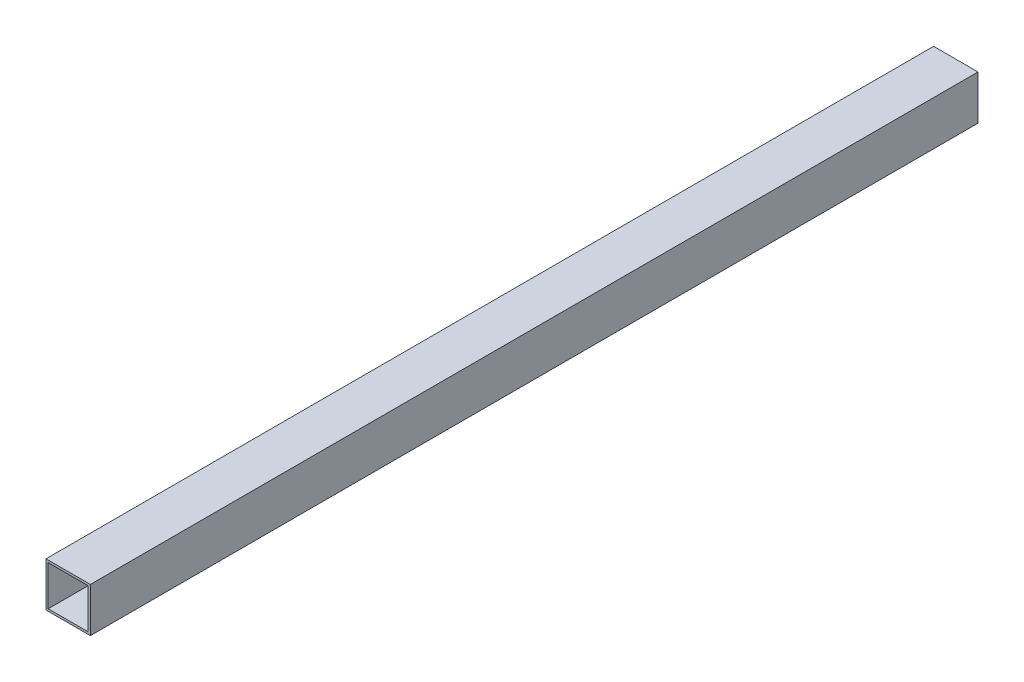
ISO-10303-21;
HEADER;
FILE_DESCRIPTION(('STEP AP214'),'2;1');
FILE_NAME('part.step','',(''),(''),'','','');
FILE_SCHEMA(('AUTOMOTIVE_DESIGN { 1 0 10303 214 1 1 1 1 }'));
ENDSEC;
DATA;
#1=APPLICATION_CONTEXT('core data for automotive mechanical design processes');
#2=APPLICATION_PROTOCOL_DEFINITION('international standard','automotive_design',2000,#1);
#3=PRODUCT_CONTEXT('',#1,'mechanical');
#4=PRODUCT('Part','Part','',(#3));
#5=PRODUCT_RELATED_PRODUCT_CATEGORY('part','',(#4));
#6=PRODUCT_DEFINITION_FORMATION('','',#4);
#7=PRODUCT_DEFINITION_CONTEXT('part definition',#1,'design');
#8=PRODUCT_DEFINITION('design','',#6,#7);
#9=PRODUCT_DEFINITION_SHAPE('','',#8);
#10=(LENGTH_UNIT() NAMED_UNIT(*) SI_UNIT(.MILLI.,.METRE.));
#11=(NAMED_UNIT(*) PLANE_ANGLE_UNIT() SI_UNIT($,.RADIAN.));
#12=(NAMED_UNIT(*) SI_UNIT($,.STERADIAN.) SOLID_ANGLE_UNIT());
#13=UNCERTAINTY_MEASURE_WITH_UNIT(LENGTH_MEASURE(1.E-05),#10,'distance_accuracy_value','');
#14=(GEOMETRIC_REPRESENTATION_CONTEXT(3) GLOBAL_UNCERTAINTY_ASSIGNED_CONTEXT((#13)) GLOBAL_UNIT_ASSIGNED_CONTEXT((#10,
#11,#12)) REPRESENTATION_CONTEXT('',''));
#15=CARTESIAN_POINT('',(0.,0.,0.));
#16=DIRECTION('',(0.,0.,1.));
#17=DIRECTION('',(1.,0.,0.));
#18=AXIS2_PLACEMENT_3D('',#15,#16,#17);
#19=CARTESIAN_POINT('',(0.,0.,400.));
#20=DIRECTION('',(0.,0.,-1.));
#21=DIRECTION('',(-1.,0.,0.));
#22=AXIS2_PLACEMENT_3D('',#19,#20,#21);
#23=PLANE('',#22);
#24=DIRECTION('',(0.,1.,0.));
#25=VECTOR('',#24,1.);
#26=CARTESIAN_POINT('',(10.,-10.,400.));
#27=LINE('',#26,#25);
#28=CARTESIAN_POINT('',(10.,-10.,400.));
#29=VERTEX_POINT('',#28);
#30=CARTESIAN_POINT('',(10.,10.,400.));
#31=VERTEX_POINT('',#30);
#32=EDGE_CURVE('E153',#29,#31,#27,.T.);
#33=ORIENTED_EDGE('',*,*,#32,.T.);
#34=DIRECTION('',(-1.,0.,0.));
#35=VECTOR('',#34,1.);
#36=CARTESIAN_POINT('',(-10.,10.,400.));
#37=LINE('',#36,#35);
#38=CARTESIAN_POINT('',(-10.,10.,400.));
#39=VERTEX_POINT('',#38);
#40=EDGE_CURVE('E157',#31,#39,#37,.T.);
#41=ORIENTED_EDGE('',*,*,#40,.T.);
#42=DIRECTION('',(0.,-1.,0.));
#43=VECTOR('',#42,1.);
#44=CARTESIAN_POINT('',(-10.,-10.,400.));
#45=LINE('',#44,#43);
#46=CARTESIAN_POINT('',(-10.,-10.,400.));
#47=VERTEX_POINT('',#46);
#48=EDGE_CURVE('E161',#39,#47,#45,.T.);
#49=ORIENTED_EDGE('',*,*,#48,.T.);
#50=DIRECTION('',(1.,0.,0.));
#51=VECTOR('',#50,1.);
#52=CARTESIAN_POINT('',(-10.,-10.,400.));
#53=LINE('',#52,#51);
#54=EDGE_CURVE('E164',#47,#29,#53,.T.);
#55=ORIENTED_EDGE('',*,*,#54,.T.);
#56=EDGE_LOOP('',(#33,#41,#49,#55));
#57=FACE_BOUND('',#56,.T.);
#58=DIRECTION('',(0.,-1.,0.));
#59=VECTOR('',#58,1.);
#60=CARTESIAN_POINT('',(-9.,-9.,400.));
#61=LINE('',#60,#59);
#62=CARTESIAN_POINT('',(-9.,9.,400.));
#63=VERTEX_POINT('',#62);
#64=CARTESIAN_POINT('',(-9.,-9.,400.));
#65=VERTEX_POINT('',#64);
#66=EDGE_CURVE('E105',#63,#65,#61,.T.);
#67=ORIENTED_EDGE('',*,*,#66,.F.);
#68=DIRECTION('',(-1.,0.,0.));
#69=VECTOR('',#68,1.);
#70=CARTESIAN_POINT('',(-9.,9.,400.));
#71=LINE('',#70,#69);
#72=CARTESIAN_POINT('',(9.,9.,400.));
#73=VERTEX_POINT('',#72);
#74=EDGE_CURVE('E131',#73,#63,#71,.T.);
#75=ORIENTED_EDGE('',*,*,#74,.F.);
#76=DIRECTION('',(0.,1.,0.));
#77=VECTOR('',#76,1.);
#78=CARTESIAN_POINT('',(9.,-9.,400.));
#79=LINE('',#78,#77);
#80=CARTESIAN_POINT('',(9.,-9.,400.));
#81=VERTEX_POINT('',#80);
#82=EDGE_CURVE('E127',#81,#73,#79,.T.);
#83=ORIENTED_EDGE('',*,*,#82,.F.);
#84=DIRECTION('',(1.,0.,0.));
#85=VECTOR('',#84,1.);
#86=CARTESIAN_POINT('',(-9.,-9.,400.));
#87=LINE('',#86,#85);
#88=EDGE_CURVE('E114',#65,#81,#87,.T.);
#89=ORIENTED_EDGE('',*,*,#88,.F.);
#90=EDGE_LOOP('',(#67,#75,#83,#89));
#91=FACE_BOUND('',#90,.T.);
#92=ADVANCED_FACE('F39',(#57,#91),#23,.F.);
#93=CARTESIAN_POINT('',(0.,0.,0.));
#94=DIRECTION('',(0.,0.,-1.));
#95=DIRECTION('',(-1.,0.,0.));
#96=AXIS2_PLACEMENT_3D('',#93,#94,#95);
#97=PLANE('',#96);
#98=DIRECTION('',(0.,1.,0.));
#99=VECTOR('',#98,1.);
#100=CARTESIAN_POINT('',(10.,-10.,0.));
#101=LINE('',#100,#99);
#102=CARTESIAN_POINT('',(10.,-10.,0.));
#103=VERTEX_POINT('',#102);
#104=CARTESIAN_POINT('',(10.,10.,0.));
#105=VERTEX_POINT('',#104);
#106=EDGE_CURVE('E123',#103,#105,#101,.T.);
#107=ORIENTED_EDGE('',*,*,#106,.F.);
#108=DIRECTION('',(1.,0.,0.));
#109=VECTOR('',#108,1.);
#110=CARTESIAN_POINT('',(-10.,-10.,0.));
#111=LINE('',#110,#109);
#112=CARTESIAN_POINT('',(-10.,-10.,0.));
#113=VERTEX_POINT('',#112);
#114=EDGE_CURVE('E158',#113,#103,#111,.T.);
#115=ORIENTED_EDGE('',*,*,#114,.F.);
#116=DIRECTION('',(0.,-1.,0.));
#117=VECTOR('',#116,1.);
#118=CARTESIAN_POINT('',(-10.,-10.,0.));
#119=LINE('',#118,#117);
#120=CARTESIAN_POINT('',(-10.,10.,0.));
#121=VERTEX_POINT('',#120);
#122=EDGE_CURVE('E174',#121,#113,#119,.T.);
#123=ORIENTED_EDGE('',*,*,#122,.F.);
#124=DIRECTION('',(-1.,0.,0.));
#125=VECTOR('',#124,1.);
#126=CARTESIAN_POINT('',(-10.,10.,0.));
#127=LINE('',#126,#125);
#128=EDGE_CURVE('E171',#105,#121,#127,.T.);
#129=ORIENTED_EDGE('',*,*,#128,.F.);
#130=EDGE_LOOP('',(#107,#115,#123,#129));
#131=FACE_BOUND('',#130,.T.);
#132=DIRECTION('',(-1.,0.,0.));
#133=VECTOR('',#132,1.);
#134=CARTESIAN_POINT('',(-9.,9.,0.));
#135=LINE('',#134,#133);
#136=CARTESIAN_POINT('',(9.,9.,0.));
#137=VERTEX_POINT('',#136);
#138=CARTESIAN_POINT('',(-9.,9.,0.));
#139=VERTEX_POINT('',#138);
#140=EDGE_CURVE('E115',#137,#139,#135,.T.);
#141=ORIENTED_EDGE('',*,*,#140,.T.);
#142=DIRECTION('',(0.,-1.,0.));
#143=VECTOR('',#142,1.);
#144=CARTESIAN_POINT('',(-9.,-9.,0.));
#145=LINE('',#144,#143);
#146=CARTESIAN_POINT('',(-9.,-9.,0.));
#147=VERTEX_POINT('',#146);
#148=EDGE_CURVE('E63',#139,#147,#145,.T.);
#149=ORIENTED_EDGE('',*,*,#148,.T.);
#150=DIRECTION('',(1.,0.,0.));
#151=VECTOR('',#150,1.);
#152=CARTESIAN_POINT('',(-9.,-9.,0.));
#153=LINE('',#152,#151);
#154=CARTESIAN_POINT('',(9.,-9.,0.));
#155=VERTEX_POINT('',#154);
#156=EDGE_CURVE('E121',#147,#155,#153,.T.);
#157=ORIENTED_EDGE('',*,*,#156,.T.);
#158=DIRECTION('',(0.,1.,0.));
#159=VECTOR('',#158,1.);
#160=CARTESIAN_POINT('',(9.,-9.,0.));
#161=LINE('',#160,#159);
#162=EDGE_CURVE('E140',#155,#137,#161,.T.);
#163=ORIENTED_EDGE('',*,*,#162,.T.);
#164=EDGE_LOOP('',(#141,#149,#157,#163));
#165=FACE_BOUND('',#164,.T.);
#166=ADVANCED_FACE('F197',(#131,#165),#97,.T.);
#167=CARTESIAN_POINT('',(10.,-10.,400.));
#168=DIRECTION('',(-1.,0.,0.));
#169=DIRECTION('',(0.,0.,1.));
#170=AXIS2_PLACEMENT_3D('',#167,#168,#169);
#171=PLANE('',#170);
#172=ORIENTED_EDGE('',*,*,#106,.T.);
#173=DIRECTION('',(0.,0.,-1.));
#174=VECTOR('',#173,1.);
#175=CARTESIAN_POINT('',(10.,10.,400.));
#176=LINE('',#175,#174);
#177=EDGE_CURVE('E11',#31,#105,#176,.T.);
#178=ORIENTED_EDGE('',*,*,#177,.F.);
#179=ORIENTED_EDGE('',*,*,#32,.F.);
#180=DIRECTION('',(0.,0.,-1.));
#181=VECTOR('',#180,1.);
#182=CARTESIAN_POINT('',(10.,-10.,400.));
#183=LINE('',#182,#181);
#184=EDGE_CURVE('E167',#29,#103,#183,.T.);
#185=ORIENTED_EDGE('',*,*,#184,.T.);
#186=EDGE_LOOP('',(#172,#178,#179,#185));
#187=FACE_BOUND('',#186,.T.);
#188=ADVANCED_FACE('F41',(#187),#171,.F.);
#189=CARTESIAN_POINT('',(-10.,10.,400.));
#190=DIRECTION('',(0.,-1.,0.));
#191=DIRECTION('',(0.,0.,-1.));
#192=AXIS2_PLACEMENT_3D('',#189,#190,#191);
#193=PLANE('',#192);
#194=ORIENTED_EDGE('',*,*,#128,.T.);
#195=DIRECTION('',(0.,0.,-1.));
#196=VECTOR('',#195,1.);
#197=CARTESIAN_POINT('',(-10.,10.,400.));
#198=LINE('',#197,#196);
#199=EDGE_CURVE('E48',#39,#121,#198,.T.);
#200=ORIENTED_EDGE('',*,*,#199,.F.);
#201=ORIENTED_EDGE('',*,*,#40,.F.);
#202=ORIENTED_EDGE('',*,*,#177,.T.);
#203=EDGE_LOOP('',(#194,#200,#201,#202));
#204=FACE_BOUND('',#203,.T.);
#205=ADVANCED_FACE('F207',(#204),#193,.F.);
#206=CARTESIAN_POINT('',(-10.,-10.,400.));
#207=DIRECTION('',(1.,0.,0.));
#208=DIRECTION('',(0.,0.,-1.));
#209=AXIS2_PLACEMENT_3D('',#206,#207,#208);
#210=PLANE('',#209);
#211=ORIENTED_EDGE('',*,*,#122,.T.);
#212=DIRECTION('',(0.,0.,-1.));
#213=VECTOR('',#212,1.);
#214=CARTESIAN_POINT('',(-10.,-10.,400.));
#215=LINE('',#214,#213);
#216=EDGE_CURVE('E182',#47,#113,#215,.T.);
#217=ORIENTED_EDGE('',*,*,#216,.F.);
#218=ORIENTED_EDGE('',*,*,#48,.F.);
#219=ORIENTED_EDGE('',*,*,#199,.T.);
#220=EDGE_LOOP('',(#211,#217,#218,#219));
#221=FACE_BOUND('',#220,.T.);
#222=ADVANCED_FACE('F191',(#221),#210,.F.);
#223=CARTESIAN_POINT('',(-10.,-10.,400.));
#224=DIRECTION('',(0.,1.,0.));
#225=DIRECTION('',(0.,0.,1.));
#226=AXIS2_PLACEMENT_3D('',#223,#224,#225);
#227=PLANE('',#226);
#228=ORIENTED_EDGE('',*,*,#114,.T.);
#229=ORIENTED_EDGE('',*,*,#184,.F.);
#230=ORIENTED_EDGE('',*,*,#54,.F.);
#231=ORIENTED_EDGE('',*,*,#216,.T.);
#232=EDGE_LOOP('',(#228,#229,#230,#231));
#233=FACE_BOUND('',#232,.T.);
#234=ADVANCED_FACE('F201',(#233),#227,.F.);
#235=CARTESIAN_POINT('',(-9.,-9.,400.));
#236=DIRECTION('',(1.,0.,0.));
#237=DIRECTION('',(0.,0.,-1.));
#238=AXIS2_PLACEMENT_3D('',#235,#236,#237);
#239=PLANE('',#238);
#240=ORIENTED_EDGE('',*,*,#148,.F.);
#241=DIRECTION('',(0.,0.,-1.));
#242=VECTOR('',#241,1.);
#243=CARTESIAN_POINT('',(-9.,9.,400.));
#244=LINE('',#243,#242);
#245=EDGE_CURVE('E109',#63,#139,#244,.T.);
#246=ORIENTED_EDGE('',*,*,#245,.F.);
#247=ORIENTED_EDGE('',*,*,#66,.T.);
#248=DIRECTION('',(0.,0.,-1.));
#249=VECTOR('',#248,1.);
#250=CARTESIAN_POINT('',(-9.,-9.,400.));
#251=LINE('',#250,#249);
#252=EDGE_CURVE('E108',#65,#147,#251,.T.);
#253=ORIENTED_EDGE('',*,*,#252,.T.);
#254=EDGE_LOOP('',(#240,#246,#247,#253));
#255=FACE_BOUND('',#254,.T.);
#256=ADVANCED_FACE('F107',(#255),#239,.T.);
#257=CARTESIAN_POINT('',(-9.,-9.,400.));
#258=DIRECTION('',(0.,1.,0.));
#259=DIRECTION('',(0.,0.,1.));
#260=AXIS2_PLACEMENT_3D('',#257,#258,#259);
#261=PLANE('',#260);
#262=ORIENTED_EDGE('',*,*,#156,.F.);
#263=ORIENTED_EDGE('',*,*,#252,.F.);
#264=ORIENTED_EDGE('',*,*,#88,.T.);
#265=DIRECTION('',(0.,0.,-1.));
#266=VECTOR('',#265,1.);
#267=CARTESIAN_POINT('',(9.,-9.,400.));
#268=LINE('',#267,#266);
#269=EDGE_CURVE('E124',#81,#155,#268,.T.);
#270=ORIENTED_EDGE('',*,*,#269,.T.);
#271=EDGE_LOOP('',(#262,#263,#264,#270));
#272=FACE_BOUND('',#271,.T.);
#273=ADVANCED_FACE('F118',(#272),#261,.T.);
#274=CARTESIAN_POINT('',(9.,-9.,400.));
#275=DIRECTION('',(-1.,0.,0.));
#276=DIRECTION('',(0.,0.,1.));
#277=AXIS2_PLACEMENT_3D('',#274,#275,#276);
#278=PLANE('',#277);
#279=ORIENTED_EDGE('',*,*,#162,.F.);
#280=ORIENTED_EDGE('',*,*,#269,.F.);
#281=ORIENTED_EDGE('',*,*,#82,.T.);
#282=DIRECTION('',(0.,0.,-1.));
#283=VECTOR('',#282,1.);
#284=CARTESIAN_POINT('',(9.,9.,400.));
#285=LINE('',#284,#283);
#286=EDGE_CURVE('E55',#73,#137,#285,.T.);
#287=ORIENTED_EDGE('',*,*,#286,.T.);
#288=EDGE_LOOP('',(#279,#280,#281,#287));
#289=FACE_BOUND('',#288,.T.);
#290=ADVANCED_FACE('F230',(#289),#278,.T.);
#291=CARTESIAN_POINT('',(-9.,9.,400.));
#292=DIRECTION('',(0.,-1.,0.));
#293=DIRECTION('',(0.,0.,-1.));
#294=AXIS2_PLACEMENT_3D('',#291,#292,#293);
#295=PLANE('',#294);
#296=ORIENTED_EDGE('',*,*,#140,.F.);
#297=ORIENTED_EDGE('',*,*,#286,.F.);
#298=ORIENTED_EDGE('',*,*,#74,.T.);
#299=ORIENTED_EDGE('',*,*,#245,.T.);
#300=EDGE_LOOP('',(#296,#297,#298,#299));
#301=FACE_BOUND('',#300,.T.);
#302=ADVANCED_FACE('F234',(#301),#295,.T.);
#303=CLOSED_SHELL('',(#92,#166,#188,#205,#222,#234,#256,#273,#290,#302));
#304=MANIFOLD_SOLID_BREP('B2',#303);
#305=ADVANCED_BREP_SHAPE_REPRESENTATION('',(#18,#304),#14);
#306=SHAPE_DEFINITION_REPRESENTATION(#9,#305);
ENDSEC;
END-ISO-10303-21;
